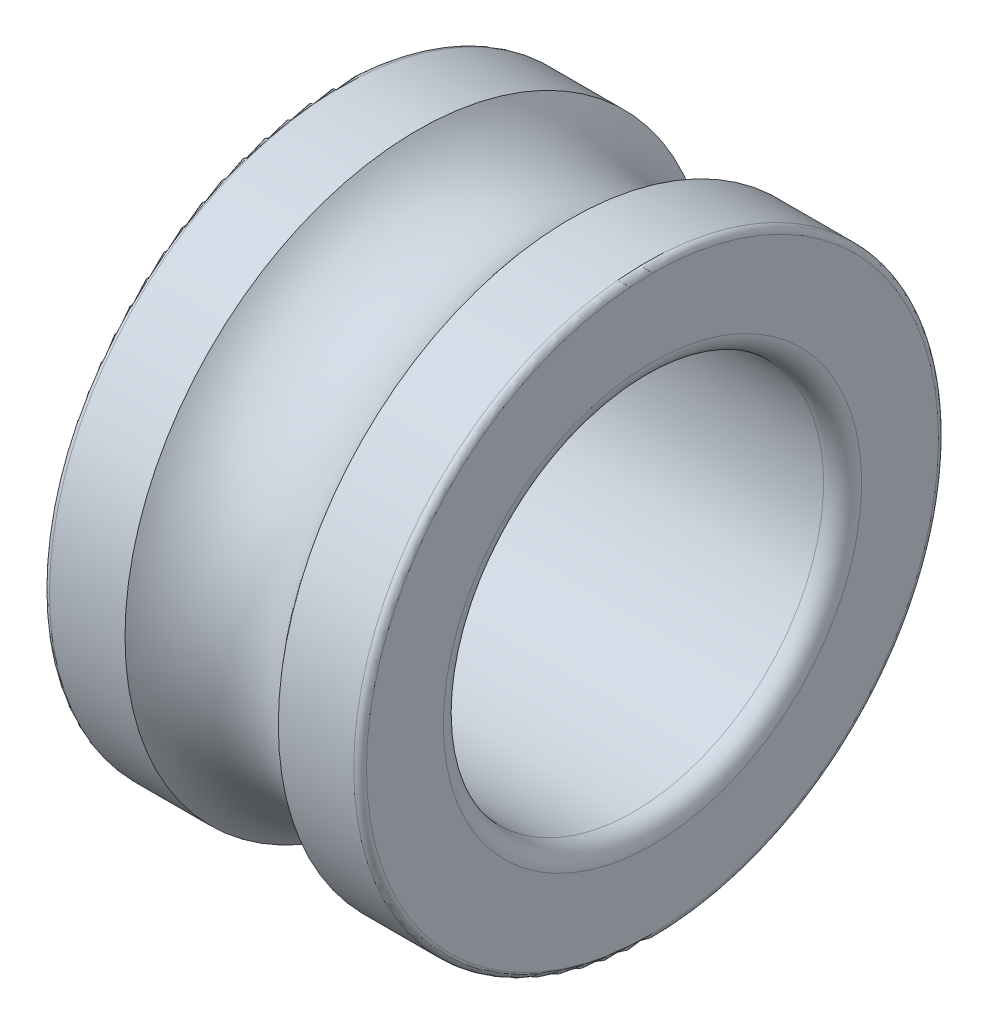
ISO-10303-21;
HEADER;
FILE_DESCRIPTION(('STEP AP214'),'2;1');
FILE_NAME('part.step','',(''),(''),'','','');
FILE_SCHEMA(('AUTOMOTIVE_DESIGN { 1 0 10303 214 1 1 1 1 }'));
ENDSEC;
DATA;
#1=APPLICATION_CONTEXT('core data for automotive mechanical design processes');
#2=APPLICATION_PROTOCOL_DEFINITION('international standard','automotive_design',2000,#1);
#3=PRODUCT_CONTEXT('',#1,'mechanical');
#4=PRODUCT('Part','Part','',(#3));
#5=PRODUCT_RELATED_PRODUCT_CATEGORY('part','',(#4));
#6=PRODUCT_DEFINITION_FORMATION('','',#4);
#7=PRODUCT_DEFINITION_CONTEXT('part definition',#1,'design');
#8=PRODUCT_DEFINITION('design','',#6,#7);
#9=PRODUCT_DEFINITION_SHAPE('','',#8);
#10=(LENGTH_UNIT() NAMED_UNIT(*) SI_UNIT(.MILLI.,.METRE.));
#11=(NAMED_UNIT(*) PLANE_ANGLE_UNIT() SI_UNIT($,.RADIAN.));
#12=(NAMED_UNIT(*) SI_UNIT($,.STERADIAN.) SOLID_ANGLE_UNIT());
#13=UNCERTAINTY_MEASURE_WITH_UNIT(LENGTH_MEASURE(1.E-05),#10,'distance_accuracy_value','');
#14=(GEOMETRIC_REPRESENTATION_CONTEXT(3) GLOBAL_UNCERTAINTY_ASSIGNED_CONTEXT((#13)) GLOBAL_UNIT_ASSIGNED_CONTEXT((#10,
#11,#12)) REPRESENTATION_CONTEXT('',''));
#15=CARTESIAN_POINT('',(0.,0.,0.));
#16=DIRECTION('',(0.,0.,1.));
#17=DIRECTION('',(1.,0.,0.));
#18=AXIS2_PLACEMENT_3D('',#15,#16,#17);
#19=CARTESIAN_POINT('',(0.600000000000047,0.,0.));
#20=DIRECTION('',(-1.,0.,0.));
#21=DIRECTION('',(0.,0.,1.));
#22=AXIS2_PLACEMENT_3D('',#19,#20,#21);
#23=TOROIDAL_SURFACE('',#22,6.60000000000005,0.600000000000047);
#24=CARTESIAN_POINT('',(0.600000000000003,0.,0.));
#25=DIRECTION('',(-1.,0.,0.));
#26=DIRECTION('',(0.,0.,1.));
#27=AXIS2_PLACEMENT_3D('',#24,#25,#26);
#28=CIRCLE('',#27,6.);
#29=CARTESIAN_POINT('',(0.600000000000003,0.,6.));
#30=VERTEX_POINT('',#29);
#31=EDGE_CURVE('E10',#30,#30,#28,.T.);
#32=ORIENTED_EDGE('',*,*,#31,.F.);
#33=EDGE_LOOP('',(#32));
#34=FACE_BOUND('',#33,.T.);
#35=CARTESIAN_POINT('',(0.,0.,0.));
#36=DIRECTION('',(-1.,0.,0.));
#37=DIRECTION('',(0.,0.,1.));
#38=AXIS2_PLACEMENT_3D('',#35,#36,#37);
#39=CIRCLE('',#38,6.6);
#40=CARTESIAN_POINT('',(0.,0.,6.6));
#41=VERTEX_POINT('',#40);
#42=EDGE_CURVE('E65',#41,#41,#39,.T.);
#43=ORIENTED_EDGE('',*,*,#42,.T.);
#44=EDGE_LOOP('',(#43));
#45=FACE_BOUND('',#44,.T.);
#46=ADVANCED_FACE('F31',(#34,#45),#23,.T.);
#47=CARTESIAN_POINT('',(100.,0.,0.));
#48=DIRECTION('',(-1.,0.,0.));
#49=DIRECTION('',(0.,0.,1.));
#50=AXIS2_PLACEMENT_3D('',#47,#48,#49);
#51=CYLINDRICAL_SURFACE('',#50,6.);
#52=CARTESIAN_POINT('',(9.40000000000001,0.,0.));
#53=DIRECTION('',(-1.,0.,0.));
#54=DIRECTION('',(0.,0.,1.));
#55=AXIS2_PLACEMENT_3D('',#52,#53,#54);
#56=CIRCLE('',#55,6.);
#57=CARTESIAN_POINT('',(9.40000000000001,0.,6.));
#58=VERTEX_POINT('',#57);
#59=EDGE_CURVE('E37',#58,#58,#56,.T.);
#60=ORIENTED_EDGE('',*,*,#59,.F.);
#61=EDGE_LOOP('',(#60));
#62=FACE_BOUND('',#61,.T.);
#63=ORIENTED_EDGE('',*,*,#31,.T.);
#64=EDGE_LOOP('',(#63));
#65=FACE_BOUND('',#64,.T.);
#66=ADVANCED_FACE('F114',(#62,#65),#51,.F.);
#67=CARTESIAN_POINT('',(9.3999999999999,0.,0.));
#68=DIRECTION('',(-1.,0.,0.));
#69=DIRECTION('',(0.,0.,1.));
#70=AXIS2_PLACEMENT_3D('',#67,#68,#69);
#71=TOROIDAL_SURFACE('',#70,6.6000000000001,0.600000000000097);
#72=CARTESIAN_POINT('',(9.99999999999999,0.,0.));
#73=DIRECTION('',(-1.,0.,0.));
#74=DIRECTION('',(0.,0.,1.));
#75=AXIS2_PLACEMENT_3D('',#72,#73,#74);
#76=CIRCLE('',#75,6.6);
#77=CARTESIAN_POINT('',(9.99999999999999,0.,6.6));
#78=VERTEX_POINT('',#77);
#79=EDGE_CURVE('E41',#78,#78,#76,.T.);
#80=ORIENTED_EDGE('',*,*,#79,.F.);
#81=EDGE_LOOP('',(#80));
#82=FACE_BOUND('',#81,.T.);
#83=ORIENTED_EDGE('',*,*,#59,.T.);
#84=EDGE_LOOP('',(#83));
#85=FACE_BOUND('',#84,.T.);
#86=ADVANCED_FACE('F109',(#82,#85),#71,.T.);
#87=CARTESIAN_POINT('',(10.,6.6,0.));
#88=DIRECTION('',(-1.,0.,0.));
#89=DIRECTION('',(0.,0.,1.));
#90=AXIS2_PLACEMENT_3D('',#87,#88,#89);
#91=PLANE('',#90);
#92=CARTESIAN_POINT('',(9.99999999999999,0.,0.));
#93=DIRECTION('',(-1.,0.,0.));
#94=DIRECTION('',(0.,0.,1.));
#95=AXIS2_PLACEMENT_3D('',#92,#93,#94);
#96=CIRCLE('',#95,9.025);
#97=CARTESIAN_POINT('',(9.99999999999999,0.,9.025));
#98=VERTEX_POINT('',#97);
#99=EDGE_CURVE('E45',#98,#98,#96,.T.);
#100=ORIENTED_EDGE('',*,*,#99,.F.);
#101=EDGE_LOOP('',(#100));
#102=FACE_BOUND('',#101,.T.);
#103=ORIENTED_EDGE('',*,*,#79,.T.);
#104=EDGE_LOOP('',(#103));
#105=FACE_BOUND('',#104,.T.);
#106=ADVANCED_FACE('F103',(#102,#105),#91,.F.);
#107=CARTESIAN_POINT('',(9.79999999999997,0.,0.));
#108=DIRECTION('',(-1.,0.,0.));
#109=DIRECTION('',(0.,0.,1.));
#110=AXIS2_PLACEMENT_3D('',#107,#108,#109);
#111=TOROIDAL_SURFACE('',#110,9.02499999999996,0.200000000000035);
#112=CARTESIAN_POINT('',(9.8,0.,0.));
#113=DIRECTION('',(-1.,0.,0.));
#114=DIRECTION('',(0.,0.,1.));
#115=AXIS2_PLACEMENT_3D('',#112,#113,#114);
#116=CIRCLE('',#115,9.225);
#117=CARTESIAN_POINT('',(9.8,0.,9.225));
#118=VERTEX_POINT('',#117);
#119=EDGE_CURVE('E50',#118,#118,#116,.T.);
#120=ORIENTED_EDGE('',*,*,#119,.F.);
#121=EDGE_LOOP('',(#120));
#122=FACE_BOUND('',#121,.T.);
#123=ORIENTED_EDGE('',*,*,#99,.T.);
#124=EDGE_LOOP('',(#123));
#125=FACE_BOUND('',#124,.T.);
#126=ADVANCED_FACE('F97',(#122,#125),#111,.T.);
#127=CARTESIAN_POINT('',(100.,0.,0.));
#128=DIRECTION('',(-1.,0.,0.));
#129=DIRECTION('',(0.,0.,1.));
#130=AXIS2_PLACEMENT_3D('',#127,#128,#129);
#131=CYLINDRICAL_SURFACE('',#130,9.225);
#132=CARTESIAN_POINT('',(7.4185481181899,0.,0.));
#133=DIRECTION('',(-1.,0.,0.));
#134=DIRECTION('',(0.,0.,1.));
#135=AXIS2_PLACEMENT_3D('',#132,#133,#134);
#136=CIRCLE('',#135,9.225);
#137=CARTESIAN_POINT('',(7.4185481181899,0.,9.225));
#138=VERTEX_POINT('',#137);
#139=EDGE_CURVE('E53',#138,#138,#136,.T.);
#140=ORIENTED_EDGE('',*,*,#139,.F.);
#141=EDGE_LOOP('',(#140));
#142=FACE_BOUND('',#141,.T.);
#143=ORIENTED_EDGE('',*,*,#119,.T.);
#144=EDGE_LOOP('',(#143));
#145=FACE_BOUND('',#144,.T.);
#146=ADVANCED_FACE('F91',(#142,#145),#131,.T.);
#147=CARTESIAN_POINT('',(5.,0.,0.));
#148=DIRECTION('',(-1.,0.,0.));
#149=DIRECTION('',(0.,0.,1.));
#150=AXIS2_PLACEMENT_3D('',#147,#148,#149);
#151=TOROIDAL_SURFACE('',#150,11.,2.99999999999996);
#152=CARTESIAN_POINT('',(2.5814518818101,0.,0.));
#153=DIRECTION('',(-1.,0.,0.));
#154=DIRECTION('',(0.,0.,1.));
#155=AXIS2_PLACEMENT_3D('',#152,#153,#154);
#156=CIRCLE('',#155,9.225);
#157=CARTESIAN_POINT('',(2.5814518818101,0.,9.225));
#158=VERTEX_POINT('',#157);
#159=EDGE_CURVE('E56',#158,#158,#156,.T.);
#160=ORIENTED_EDGE('',*,*,#159,.F.);
#161=EDGE_LOOP('',(#160));
#162=FACE_BOUND('',#161,.T.);
#163=ORIENTED_EDGE('',*,*,#139,.T.);
#164=EDGE_LOOP('',(#163));
#165=FACE_BOUND('',#164,.T.);
#166=ADVANCED_FACE('F85',(#162,#165),#151,.F.);
#167=CARTESIAN_POINT('',(100.,0.,0.));
#168=DIRECTION('',(-1.,0.,0.));
#169=DIRECTION('',(0.,0.,1.));
#170=AXIS2_PLACEMENT_3D('',#167,#168,#169);
#171=CYLINDRICAL_SURFACE('',#170,9.225);
#172=CARTESIAN_POINT('',(0.200000000000006,0.,0.));
#173=DIRECTION('',(-1.,0.,0.));
#174=DIRECTION('',(0.,0.,1.));
#175=AXIS2_PLACEMENT_3D('',#172,#173,#174);
#176=CIRCLE('',#175,9.225);
#177=CARTESIAN_POINT('',(0.200000000000006,0.,9.225));
#178=VERTEX_POINT('',#177);
#179=EDGE_CURVE('E59',#178,#178,#176,.T.);
#180=ORIENTED_EDGE('',*,*,#179,.F.);
#181=EDGE_LOOP('',(#180));
#182=FACE_BOUND('',#181,.T.);
#183=ORIENTED_EDGE('',*,*,#159,.T.);
#184=EDGE_LOOP('',(#183));
#185=FACE_BOUND('',#184,.T.);
#186=ADVANCED_FACE('F79',(#182,#185),#171,.T.);
#187=CARTESIAN_POINT('',(0.20000000000002,0.,0.));
#188=DIRECTION('',(-1.,0.,0.));
#189=DIRECTION('',(0.,0.,1.));
#190=AXIS2_PLACEMENT_3D('',#187,#188,#189);
#191=TOROIDAL_SURFACE('',#190,9.02499999999998,0.20000000000002);
#192=CARTESIAN_POINT('',(0.,0.,0.));
#193=DIRECTION('',(-1.,0.,0.));
#194=DIRECTION('',(0.,0.,1.));
#195=AXIS2_PLACEMENT_3D('',#192,#193,#194);
#196=CIRCLE('',#195,9.025);
#197=CARTESIAN_POINT('',(0.,0.,9.025));
#198=VERTEX_POINT('',#197);
#199=EDGE_CURVE('E62',#198,#198,#196,.T.);
#200=ORIENTED_EDGE('',*,*,#199,.F.);
#201=EDGE_LOOP('',(#200));
#202=FACE_BOUND('',#201,.T.);
#203=ORIENTED_EDGE('',*,*,#179,.T.);
#204=EDGE_LOOP('',(#203));
#205=FACE_BOUND('',#204,.T.);
#206=ADVANCED_FACE('F73',(#202,#205),#191,.T.);
#207=CARTESIAN_POINT('',(0.,9.025,0.));
#208=DIRECTION('',(1.,0.,0.));
#209=DIRECTION('',(0.,0.,-1.));
#210=AXIS2_PLACEMENT_3D('',#207,#208,#209);
#211=PLANE('',#210);
#212=ORIENTED_EDGE('',*,*,#42,.F.);
#213=EDGE_LOOP('',(#212));
#214=FACE_BOUND('',#213,.T.);
#215=ORIENTED_EDGE('',*,*,#199,.T.);
#216=EDGE_LOOP('',(#215));
#217=FACE_BOUND('',#216,.T.);
#218=ADVANCED_FACE('F70',(#214,#217),#211,.F.);
#219=CLOSED_SHELL('',(#46,#66,#86,#106,#126,#146,#166,#186,#206,#218));
#220=MANIFOLD_SOLID_BREP('B2',#219);
#221=ADVANCED_BREP_SHAPE_REPRESENTATION('',(#18,#220),#14);
#222=SHAPE_DEFINITION_REPRESENTATION(#9,#221);
ENDSEC;
END-ISO-10303-21;
